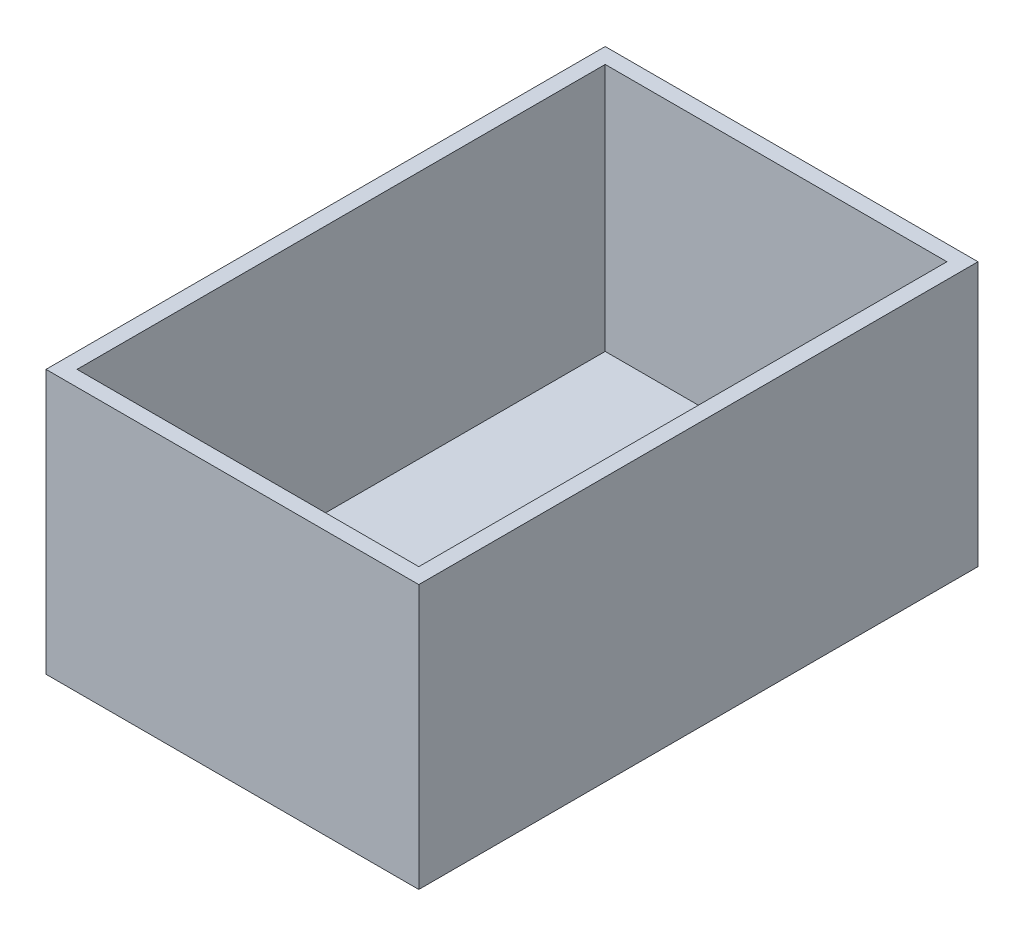
ISO-10303-21;
HEADER;
FILE_DESCRIPTION(('STEP AP214'),'2;1');
FILE_NAME('part.step','',(''),(''),'','','');
FILE_SCHEMA(('AUTOMOTIVE_DESIGN { 1 0 10303 214 1 1 1 1 }'));
ENDSEC;
DATA;
#1=APPLICATION_CONTEXT('core data for automotive mechanical design processes');
#2=APPLICATION_PROTOCOL_DEFINITION('international standard','automotive_design',2000,#1);
#3=PRODUCT_CONTEXT('',#1,'mechanical');
#4=PRODUCT('Part','Part','',(#3));
#5=PRODUCT_RELATED_PRODUCT_CATEGORY('part','',(#4));
#6=PRODUCT_DEFINITION_FORMATION('','',#4);
#7=PRODUCT_DEFINITION_CONTEXT('part definition',#1,'design');
#8=PRODUCT_DEFINITION('design','',#6,#7);
#9=PRODUCT_DEFINITION_SHAPE('','',#8);
#10=(LENGTH_UNIT() NAMED_UNIT(*) SI_UNIT(.MILLI.,.METRE.));
#11=(NAMED_UNIT(*) PLANE_ANGLE_UNIT() SI_UNIT($,.RADIAN.));
#12=(NAMED_UNIT(*) SI_UNIT($,.STERADIAN.) SOLID_ANGLE_UNIT());
#13=UNCERTAINTY_MEASURE_WITH_UNIT(LENGTH_MEASURE(1.E-05),#10,'distance_accuracy_value','');
#14=(GEOMETRIC_REPRESENTATION_CONTEXT(3) GLOBAL_UNCERTAINTY_ASSIGNED_CONTEXT((#13)) GLOBAL_UNIT_ASSIGNED_CONTEXT((#10,
#11,#12)) REPRESENTATION_CONTEXT('',''));
#15=CARTESIAN_POINT('',(0.,0.,0.));
#16=DIRECTION('',(0.,0.,1.));
#17=DIRECTION('',(1.,0.,0.));
#18=AXIS2_PLACEMENT_3D('',#15,#16,#17);
#19=CARTESIAN_POINT('',(60.,5.,-90.));
#20=DIRECTION('',(-1.,0.,0.));
#21=DIRECTION('',(0.,0.,1.));
#22=AXIS2_PLACEMENT_3D('',#19,#20,#21);
#23=PLANE('',#22);
#24=DIRECTION('',(0.,0.,-1.));
#25=VECTOR('',#24,1.);
#26=CARTESIAN_POINT('',(60.,0.,-90.));
#27=LINE('',#26,#25);
#28=CARTESIAN_POINT('',(60.,0.,90.));
#29=VERTEX_POINT('',#28);
#30=CARTESIAN_POINT('',(60.,0.,-90.));
#31=VERTEX_POINT('',#30);
#32=EDGE_CURVE('E167',#29,#31,#27,.T.);
#33=ORIENTED_EDGE('',*,*,#32,.T.);
#34=DIRECTION('',(0.,-1.,0.));
#35=VECTOR('',#34,1.);
#36=CARTESIAN_POINT('',(60.,5.,-90.));
#37=LINE('',#36,#35);
#38=CARTESIAN_POINT('',(60.,85.,-90.));
#39=VERTEX_POINT('',#38);
#40=EDGE_CURVE('E11',#39,#31,#37,.T.);
#41=ORIENTED_EDGE('',*,*,#40,.F.);
#42=DIRECTION('',(0.,0.,-1.));
#43=VECTOR('',#42,1.);
#44=CARTESIAN_POINT('',(60.,85.,-90.));
#45=LINE('',#44,#43);
#46=CARTESIAN_POINT('',(60.,85.,90.));
#47=VERTEX_POINT('',#46);
#48=EDGE_CURVE('E120',#47,#39,#45,.T.);
#49=ORIENTED_EDGE('',*,*,#48,.F.);
#50=DIRECTION('',(0.,-1.,0.));
#51=VECTOR('',#50,1.);
#52=CARTESIAN_POINT('',(60.,5.,90.));
#53=LINE('',#52,#51);
#54=EDGE_CURVE('E180',#47,#29,#53,.T.);
#55=ORIENTED_EDGE('',*,*,#54,.T.);
#56=EDGE_LOOP('',(#33,#41,#49,#55));
#57=FACE_BOUND('',#56,.T.);
#58=ADVANCED_FACE('F39',(#57),#23,.F.);
#59=CARTESIAN_POINT('',(-60.,5.,-90.));
#60=DIRECTION('',(0.,0.,1.));
#61=DIRECTION('',(1.,0.,0.));
#62=AXIS2_PLACEMENT_3D('',#59,#60,#61);
#63=PLANE('',#62);
#64=DIRECTION('',(-1.,0.,0.));
#65=VECTOR('',#64,1.);
#66=CARTESIAN_POINT('',(-60.,0.,-90.));
#67=LINE('',#66,#65);
#68=CARTESIAN_POINT('',(-60.,0.,-90.));
#69=VERTEX_POINT('',#68);
#70=EDGE_CURVE('E171',#31,#69,#67,.T.);
#71=ORIENTED_EDGE('',*,*,#70,.T.);
#72=DIRECTION('',(0.,-1.,0.));
#73=VECTOR('',#72,1.);
#74=CARTESIAN_POINT('',(-60.,5.,-90.));
#75=LINE('',#74,#73);
#76=CARTESIAN_POINT('',(-60.,85.,-90.));
#77=VERTEX_POINT('',#76);
#78=EDGE_CURVE('E47',#77,#69,#75,.T.);
#79=ORIENTED_EDGE('',*,*,#78,.F.);
#80=DIRECTION('',(-1.,0.,0.));
#81=VECTOR('',#80,1.);
#82=CARTESIAN_POINT('',(-60.,85.,-90.));
#83=LINE('',#82,#81);
#84=EDGE_CURVE('E155',#39,#77,#83,.T.);
#85=ORIENTED_EDGE('',*,*,#84,.F.);
#86=ORIENTED_EDGE('',*,*,#40,.T.);
#87=EDGE_LOOP('',(#71,#79,#85,#86));
#88=FACE_BOUND('',#87,.T.);
#89=ADVANCED_FACE('F205',(#88),#63,.F.);
#90=CARTESIAN_POINT('',(-60.,5.,-90.));
#91=DIRECTION('',(1.,0.,0.));
#92=DIRECTION('',(0.,0.,-1.));
#93=AXIS2_PLACEMENT_3D('',#90,#91,#92);
#94=PLANE('',#93);
#95=DIRECTION('',(0.,0.,1.));
#96=VECTOR('',#95,1.);
#97=CARTESIAN_POINT('',(-60.,0.,-90.));
#98=LINE('',#97,#96);
#99=CARTESIAN_POINT('',(-60.,0.,90.));
#100=VERTEX_POINT('',#99);
#101=EDGE_CURVE('E174',#69,#100,#98,.T.);
#102=ORIENTED_EDGE('',*,*,#101,.T.);
#103=DIRECTION('',(0.,-1.,0.));
#104=VECTOR('',#103,1.);
#105=CARTESIAN_POINT('',(-60.,5.,90.));
#106=LINE('',#105,#104);
#107=CARTESIAN_POINT('',(-60.,85.,90.));
#108=VERTEX_POINT('',#107);
#109=EDGE_CURVE('E184',#108,#100,#106,.T.);
#110=ORIENTED_EDGE('',*,*,#109,.F.);
#111=DIRECTION('',(0.,0.,1.));
#112=VECTOR('',#111,1.);
#113=CARTESIAN_POINT('',(-60.,85.,-90.));
#114=LINE('',#113,#112);
#115=EDGE_CURVE('E159',#77,#108,#114,.T.);
#116=ORIENTED_EDGE('',*,*,#115,.F.);
#117=ORIENTED_EDGE('',*,*,#78,.T.);
#118=EDGE_LOOP('',(#102,#110,#116,#117));
#119=FACE_BOUND('',#118,.T.);
#120=ADVANCED_FACE('F192',(#119),#94,.F.);
#121=CARTESIAN_POINT('',(-60.,5.,90.));
#122=DIRECTION('',(0.,0.,-1.));
#123=DIRECTION('',(-1.,0.,0.));
#124=AXIS2_PLACEMENT_3D('',#121,#122,#123);
#125=PLANE('',#124);
#126=DIRECTION('',(1.,0.,0.));
#127=VECTOR('',#126,1.);
#128=CARTESIAN_POINT('',(-60.,0.,90.));
#129=LINE('',#128,#127);
#130=EDGE_CURVE('E177',#100,#29,#129,.T.);
#131=ORIENTED_EDGE('',*,*,#130,.T.);
#132=ORIENTED_EDGE('',*,*,#54,.F.);
#133=DIRECTION('',(1.,0.,0.));
#134=VECTOR('',#133,1.);
#135=CARTESIAN_POINT('',(-60.,85.,90.));
#136=LINE('',#135,#134);
#137=EDGE_CURVE('E163',#108,#47,#136,.T.);
#138=ORIENTED_EDGE('',*,*,#137,.F.);
#139=ORIENTED_EDGE('',*,*,#109,.T.);
#140=EDGE_LOOP('',(#131,#132,#138,#139));
#141=FACE_BOUND('',#140,.T.);
#142=ADVANCED_FACE('F200',(#141),#125,.F.);
#143=CARTESIAN_POINT('',(0.,0.,0.));
#144=DIRECTION('',(0.,1.,0.));
#145=DIRECTION('',(0.,0.,1.));
#146=AXIS2_PLACEMENT_3D('',#143,#144,#145);
#147=PLANE('',#146);
#148=ORIENTED_EDGE('',*,*,#32,.F.);
#149=ORIENTED_EDGE('',*,*,#130,.F.);
#150=ORIENTED_EDGE('',*,*,#101,.F.);
#151=ORIENTED_EDGE('',*,*,#70,.F.);
#152=EDGE_LOOP('',(#148,#149,#150,#151));
#153=FACE_BOUND('',#152,.T.);
#154=ADVANCED_FACE('F198',(#153),#147,.F.);
#155=CARTESIAN_POINT('',(0.,85.,0.));
#156=DIRECTION('',(0.,1.,0.));
#157=DIRECTION('',(0.,0.,1.));
#158=AXIS2_PLACEMENT_3D('',#155,#156,#157);
#159=PLANE('',#158);
#160=ORIENTED_EDGE('',*,*,#48,.T.);
#161=ORIENTED_EDGE('',*,*,#84,.T.);
#162=ORIENTED_EDGE('',*,*,#115,.T.);
#163=ORIENTED_EDGE('',*,*,#137,.T.);
#164=EDGE_LOOP('',(#160,#161,#162,#163));
#165=FACE_BOUND('',#164,.T.);
#166=DIRECTION('',(-1.,0.,0.));
#167=VECTOR('',#166,1.);
#168=CARTESIAN_POINT('',(-55.,85.,-85.));
#169=LINE('',#168,#167);
#170=CARTESIAN_POINT('',(55.,85.,-85.));
#171=VERTEX_POINT('',#170);
#172=CARTESIAN_POINT('',(-55.,85.,-85.));
#173=VERTEX_POINT('',#172);
#174=EDGE_CURVE('E113',#171,#173,#169,.T.);
#175=ORIENTED_EDGE('',*,*,#174,.F.);
#176=DIRECTION('',(0.,0.,-1.));
#177=VECTOR('',#176,1.);
#178=CARTESIAN_POINT('',(55.,85.,-85.));
#179=LINE('',#178,#177);
#180=CARTESIAN_POINT('',(55.,85.,85.));
#181=VERTEX_POINT('',#180);
#182=EDGE_CURVE('E103',#181,#171,#179,.T.);
#183=ORIENTED_EDGE('',*,*,#182,.F.);
#184=DIRECTION('',(1.,0.,0.));
#185=VECTOR('',#184,1.);
#186=CARTESIAN_POINT('',(-55.,85.,85.));
#187=LINE('',#186,#185);
#188=CARTESIAN_POINT('',(-55.,85.,85.));
#189=VERTEX_POINT('',#188);
#190=EDGE_CURVE('E130',#189,#181,#187,.T.);
#191=ORIENTED_EDGE('',*,*,#190,.F.);
#192=DIRECTION('',(0.,0.,1.));
#193=VECTOR('',#192,1.);
#194=CARTESIAN_POINT('',(-55.,85.,-85.));
#195=LINE('',#194,#193);
#196=EDGE_CURVE('E126',#173,#189,#195,.T.);
#197=ORIENTED_EDGE('',*,*,#196,.F.);
#198=EDGE_LOOP('',(#175,#183,#191,#197));
#199=FACE_BOUND('',#198,.T.);
#200=ADVANCED_FACE('F124',(#165,#199),#159,.T.);
#201=CARTESIAN_POINT('',(55.,85.,-85.));
#202=DIRECTION('',(-1.,0.,0.));
#203=DIRECTION('',(0.,0.,1.));
#204=AXIS2_PLACEMENT_3D('',#201,#202,#203);
#205=PLANE('',#204);
#206=DIRECTION('',(0.,0.,-1.));
#207=VECTOR('',#206,1.);
#208=CARTESIAN_POINT('',(55.,5.,-85.));
#209=LINE('',#208,#207);
#210=CARTESIAN_POINT('',(55.,5.,85.));
#211=VERTEX_POINT('',#210);
#212=CARTESIAN_POINT('',(55.,5.,-85.));
#213=VERTEX_POINT('',#212);
#214=EDGE_CURVE('E54',#211,#213,#209,.T.);
#215=ORIENTED_EDGE('',*,*,#214,.F.);
#216=DIRECTION('',(0.,-1.,0.));
#217=VECTOR('',#216,1.);
#218=CARTESIAN_POINT('',(55.,85.,85.));
#219=LINE('',#218,#217);
#220=EDGE_CURVE('E108',#181,#211,#219,.T.);
#221=ORIENTED_EDGE('',*,*,#220,.F.);
#222=ORIENTED_EDGE('',*,*,#182,.T.);
#223=DIRECTION('',(0.,-1.,0.));
#224=VECTOR('',#223,1.);
#225=CARTESIAN_POINT('',(55.,85.,-85.));
#226=LINE('',#225,#224);
#227=EDGE_CURVE('E106',#171,#213,#226,.T.);
#228=ORIENTED_EDGE('',*,*,#227,.T.);
#229=EDGE_LOOP('',(#215,#221,#222,#228));
#230=FACE_BOUND('',#229,.T.);
#231=ADVANCED_FACE('F105',(#230),#205,.T.);
#232=CARTESIAN_POINT('',(-55.,85.,-85.));
#233=DIRECTION('',(0.,0.,1.));
#234=DIRECTION('',(1.,0.,0.));
#235=AXIS2_PLACEMENT_3D('',#232,#233,#234);
#236=PLANE('',#235);
#237=DIRECTION('',(-1.,0.,0.));
#238=VECTOR('',#237,1.);
#239=CARTESIAN_POINT('',(-55.,5.,-85.));
#240=LINE('',#239,#238);
#241=CARTESIAN_POINT('',(-55.,5.,-85.));
#242=VERTEX_POINT('',#241);
#243=EDGE_CURVE('E58',#213,#242,#240,.T.);
#244=ORIENTED_EDGE('',*,*,#243,.F.);
#245=ORIENTED_EDGE('',*,*,#227,.F.);
#246=ORIENTED_EDGE('',*,*,#174,.T.);
#247=DIRECTION('',(0.,-1.,0.));
#248=VECTOR('',#247,1.);
#249=CARTESIAN_POINT('',(-55.,85.,-85.));
#250=LINE('',#249,#248);
#251=EDGE_CURVE('E121',#173,#242,#250,.T.);
#252=ORIENTED_EDGE('',*,*,#251,.T.);
#253=EDGE_LOOP('',(#244,#245,#246,#252));
#254=FACE_BOUND('',#253,.T.);
#255=ADVANCED_FACE('F117',(#254),#236,.T.);
#256=CARTESIAN_POINT('',(-55.,85.,-85.));
#257=DIRECTION('',(1.,0.,0.));
#258=DIRECTION('',(0.,0.,-1.));
#259=AXIS2_PLACEMENT_3D('',#256,#257,#258);
#260=PLANE('',#259);
#261=DIRECTION('',(0.,0.,1.));
#262=VECTOR('',#261,1.);
#263=CARTESIAN_POINT('',(-55.,5.,-85.));
#264=LINE('',#263,#262);
#265=CARTESIAN_POINT('',(-55.,5.,85.));
#266=VERTEX_POINT('',#265);
#267=EDGE_CURVE('E139',#242,#266,#264,.T.);
#268=ORIENTED_EDGE('',*,*,#267,.F.);
#269=ORIENTED_EDGE('',*,*,#251,.F.);
#270=ORIENTED_EDGE('',*,*,#196,.T.);
#271=DIRECTION('',(0.,-1.,0.));
#272=VECTOR('',#271,1.);
#273=CARTESIAN_POINT('',(-55.,85.,85.));
#274=LINE('',#273,#272);
#275=EDGE_CURVE('E146',#189,#266,#274,.T.);
#276=ORIENTED_EDGE('',*,*,#275,.T.);
#277=EDGE_LOOP('',(#268,#269,#270,#276));
#278=FACE_BOUND('',#277,.T.);
#279=ADVANCED_FACE('F227',(#278),#260,.T.);
#280=CARTESIAN_POINT('',(-55.,85.,85.));
#281=DIRECTION('',(0.,0.,-1.));
#282=DIRECTION('',(-1.,0.,0.));
#283=AXIS2_PLACEMENT_3D('',#280,#281,#282);
#284=PLANE('',#283);
#285=DIRECTION('',(1.,0.,0.));
#286=VECTOR('',#285,1.);
#287=CARTESIAN_POINT('',(-55.,5.,85.));
#288=LINE('',#287,#286);
#289=EDGE_CURVE('E114',#266,#211,#288,.T.);
#290=ORIENTED_EDGE('',*,*,#289,.F.);
#291=ORIENTED_EDGE('',*,*,#275,.F.);
#292=ORIENTED_EDGE('',*,*,#190,.T.);
#293=ORIENTED_EDGE('',*,*,#220,.T.);
#294=EDGE_LOOP('',(#290,#291,#292,#293));
#295=FACE_BOUND('',#294,.T.);
#296=ADVANCED_FACE('F220',(#295),#284,.T.);
#297=CARTESIAN_POINT('',(0.,5.,0.));
#298=DIRECTION('',(0.,1.,0.));
#299=DIRECTION('',(0.,0.,1.));
#300=AXIS2_PLACEMENT_3D('',#297,#298,#299);
#301=PLANE('',#300);
#302=ORIENTED_EDGE('',*,*,#214,.T.);
#303=ORIENTED_EDGE('',*,*,#243,.T.);
#304=ORIENTED_EDGE('',*,*,#267,.T.);
#305=ORIENTED_EDGE('',*,*,#289,.T.);
#306=EDGE_LOOP('',(#302,#303,#304,#305));
#307=FACE_BOUND('',#306,.T.);
#308=ADVANCED_FACE('F217',(#307),#301,.T.);
#309=CLOSED_SHELL('',(#58,#89,#120,#142,#154,#200,#231,#255,#279,#296,#308));
#310=MANIFOLD_SOLID_BREP('B2',#309);
#311=ADVANCED_BREP_SHAPE_REPRESENTATION('',(#18,#310),#14);
#312=SHAPE_DEFINITION_REPRESENTATION(#9,#311);
ENDSEC;
END-ISO-10303-21;
